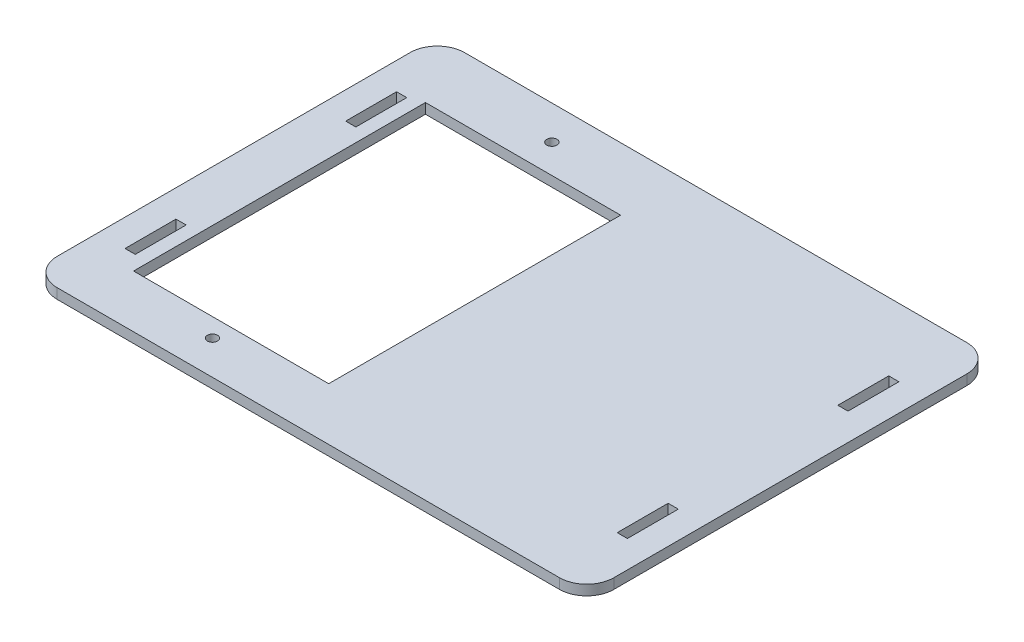
ISO-10303-21;
HEADER;
FILE_DESCRIPTION(('STEP AP214'),'2;1');
FILE_NAME('part.step','',(''),(''),'','','');
FILE_SCHEMA(('AUTOMOTIVE_DESIGN { 1 0 10303 214 1 1 1 1 }'));
ENDSEC;
DATA;
#1=APPLICATION_CONTEXT('core data for automotive mechanical design processes');
#2=APPLICATION_PROTOCOL_DEFINITION('international standard','automotive_design',2000,#1);
#3=PRODUCT_CONTEXT('',#1,'mechanical');
#4=PRODUCT('Part','Part','',(#3));
#5=PRODUCT_RELATED_PRODUCT_CATEGORY('part','',(#4));
#6=PRODUCT_DEFINITION_FORMATION('','',#4);
#7=PRODUCT_DEFINITION_CONTEXT('part definition',#1,'design');
#8=PRODUCT_DEFINITION('design','',#6,#7);
#9=PRODUCT_DEFINITION_SHAPE('','',#8);
#10=(LENGTH_UNIT() NAMED_UNIT(*) SI_UNIT(.MILLI.,.METRE.));
#11=(NAMED_UNIT(*) PLANE_ANGLE_UNIT() SI_UNIT($,.RADIAN.));
#12=(NAMED_UNIT(*) SI_UNIT($,.STERADIAN.) SOLID_ANGLE_UNIT());
#13=UNCERTAINTY_MEASURE_WITH_UNIT(LENGTH_MEASURE(1.E-05),#10,'distance_accuracy_value','');
#14=(GEOMETRIC_REPRESENTATION_CONTEXT(3) GLOBAL_UNCERTAINTY_ASSIGNED_CONTEXT((#13)) GLOBAL_UNIT_ASSIGNED_CONTEXT((#10,
#11,#12)) REPRESENTATION_CONTEXT('',''));
#15=CARTESIAN_POINT('',(0.,0.,0.));
#16=DIRECTION('',(0.,0.,1.));
#17=DIRECTION('',(1.,0.,0.));
#18=AXIS2_PLACEMENT_3D('',#15,#16,#17);
#19=CARTESIAN_POINT('',(74.,3.,-52.));
#20=DIRECTION('',(0.,-1.,0.));
#21=DIRECTION('',(0.,0.,-1.));
#22=AXIS2_PLACEMENT_3D('',#19,#20,#21);
#23=CYLINDRICAL_SURFACE('',#22,8.00000000000001);
#24=CARTESIAN_POINT('',(74.,0.,-52.));
#25=DIRECTION('',(0.,1.,0.));
#26=DIRECTION('',(0.,0.,-1.));
#27=AXIS2_PLACEMENT_3D('',#24,#25,#26);
#28=CIRCLE('',#27,8.00000000000001);
#29=CARTESIAN_POINT('',(82.,0.,-52.));
#30=VERTEX_POINT('',#29);
#31=CARTESIAN_POINT('',(74.,0.,-60.));
#32=VERTEX_POINT('',#31);
#33=EDGE_CURVE('E387',#30,#32,#28,.T.);
#34=ORIENTED_EDGE('',*,*,#33,.T.);
#35=DIRECTION('',(0.,-1.,0.));
#36=VECTOR('',#35,1.);
#37=CARTESIAN_POINT('',(74.,3.,-60.));
#38=LINE('',#37,#36);
#39=CARTESIAN_POINT('',(74.,3.,-60.));
#40=VERTEX_POINT('',#39);
#41=EDGE_CURVE('E11',#40,#32,#38,.T.);
#42=ORIENTED_EDGE('',*,*,#41,.F.);
#43=CARTESIAN_POINT('',(74.,3.,-52.));
#44=DIRECTION('',(0.,1.,0.));
#45=DIRECTION('',(0.,0.,-1.));
#46=AXIS2_PLACEMENT_3D('',#43,#44,#45);
#47=CIRCLE('',#46,8.00000000000001);
#48=CARTESIAN_POINT('',(82.,3.,-52.));
#49=VERTEX_POINT('',#48);
#50=EDGE_CURVE('E394',#49,#40,#47,.T.);
#51=ORIENTED_EDGE('',*,*,#50,.F.);
#52=DIRECTION('',(0.,-1.,0.));
#53=VECTOR('',#52,1.);
#54=CARTESIAN_POINT('',(82.,3.,-52.));
#55=LINE('',#54,#53);
#56=EDGE_CURVE('E412',#49,#30,#55,.T.);
#57=ORIENTED_EDGE('',*,*,#56,.T.);
#58=EDGE_LOOP('',(#34,#42,#51,#57));
#59=FACE_BOUND('',#58,.T.);
#60=ADVANCED_FACE('F33',(#59),#23,.T.);
#61=CARTESIAN_POINT('',(-74.,3.,-60.));
#62=DIRECTION('',(0.,0.,1.));
#63=DIRECTION('',(1.,0.,0.));
#64=AXIS2_PLACEMENT_3D('',#61,#62,#63);
#65=PLANE('',#64);
#66=DIRECTION('',(-1.,0.,0.));
#67=VECTOR('',#66,1.);
#68=CARTESIAN_POINT('',(-74.,0.,-60.));
#69=LINE('',#68,#67);
#70=CARTESIAN_POINT('',(-74.,0.,-60.));
#71=VERTEX_POINT('',#70);
#72=EDGE_CURVE('E415',#32,#71,#69,.T.);
#73=ORIENTED_EDGE('',*,*,#72,.T.);
#74=DIRECTION('',(0.,-1.,0.));
#75=VECTOR('',#74,1.);
#76=CARTESIAN_POINT('',(-74.,3.,-60.));
#77=LINE('',#76,#75);
#78=CARTESIAN_POINT('',(-74.,3.,-60.));
#79=VERTEX_POINT('',#78);
#80=EDGE_CURVE('E40',#79,#71,#77,.T.);
#81=ORIENTED_EDGE('',*,*,#80,.F.);
#82=DIRECTION('',(-1.,0.,0.));
#83=VECTOR('',#82,1.);
#84=CARTESIAN_POINT('',(-74.,3.,-60.));
#85=LINE('',#84,#83);
#86=EDGE_CURVE('E397',#40,#79,#85,.T.);
#87=ORIENTED_EDGE('',*,*,#86,.F.);
#88=ORIENTED_EDGE('',*,*,#41,.T.);
#89=EDGE_LOOP('',(#73,#81,#87,#88));
#90=FACE_BOUND('',#89,.T.);
#91=ADVANCED_FACE('F471',(#90),#65,.F.);
#92=CARTESIAN_POINT('',(-74.,3.,-52.));
#93=DIRECTION('',(0.,-1.,0.));
#94=DIRECTION('',(0.,0.,-1.));
#95=AXIS2_PLACEMENT_3D('',#92,#93,#94);
#96=CYLINDRICAL_SURFACE('',#95,8.00000000000001);
#97=CARTESIAN_POINT('',(-74.,0.,-52.));
#98=DIRECTION('',(0.,1.,0.));
#99=DIRECTION('',(0.,0.,-1.));
#100=AXIS2_PLACEMENT_3D('',#97,#98,#99);
#101=CIRCLE('',#100,8.00000000000001);
#102=CARTESIAN_POINT('',(-82.,0.,-52.));
#103=VERTEX_POINT('',#102);
#104=EDGE_CURVE('E417',#71,#103,#101,.T.);
#105=ORIENTED_EDGE('',*,*,#104,.T.);
#106=DIRECTION('',(0.,-1.,0.));
#107=VECTOR('',#106,1.);
#108=CARTESIAN_POINT('',(-82.,3.,-52.));
#109=LINE('',#108,#107);
#110=CARTESIAN_POINT('',(-82.,3.,-52.));
#111=VERTEX_POINT('',#110);
#112=EDGE_CURVE('E442',#111,#103,#109,.T.);
#113=ORIENTED_EDGE('',*,*,#112,.F.);
#114=CARTESIAN_POINT('',(-74.,3.,-52.));
#115=DIRECTION('',(0.,1.,0.));
#116=DIRECTION('',(0.,0.,-1.));
#117=AXIS2_PLACEMENT_3D('',#114,#115,#116);
#118=CIRCLE('',#117,8.00000000000001);
#119=EDGE_CURVE('E400',#79,#111,#118,.T.);
#120=ORIENTED_EDGE('',*,*,#119,.F.);
#121=ORIENTED_EDGE('',*,*,#80,.T.);
#122=EDGE_LOOP('',(#105,#113,#120,#121));
#123=FACE_BOUND('',#122,.T.);
#124=ADVANCED_FACE('F449',(#123),#96,.T.);
#125=CARTESIAN_POINT('',(-82.,3.,-52.));
#126=DIRECTION('',(1.,0.,0.));
#127=DIRECTION('',(0.,0.,-1.));
#128=AXIS2_PLACEMENT_3D('',#125,#126,#127);
#129=PLANE('',#128);
#130=DIRECTION('',(0.,0.,1.));
#131=VECTOR('',#130,1.);
#132=CARTESIAN_POINT('',(-82.,0.,-52.));
#133=LINE('',#132,#131);
#134=CARTESIAN_POINT('',(-82.,0.,52.));
#135=VERTEX_POINT('',#134);
#136=EDGE_CURVE('E419',#103,#135,#133,.T.);
#137=ORIENTED_EDGE('',*,*,#136,.T.);
#138=DIRECTION('',(0.,-1.,0.));
#139=VECTOR('',#138,1.);
#140=CARTESIAN_POINT('',(-82.,3.,52.));
#141=LINE('',#140,#139);
#142=CARTESIAN_POINT('',(-82.,3.,52.));
#143=VERTEX_POINT('',#142);
#144=EDGE_CURVE('E439',#143,#135,#141,.T.);
#145=ORIENTED_EDGE('',*,*,#144,.F.);
#146=DIRECTION('',(0.,0.,1.));
#147=VECTOR('',#146,1.);
#148=CARTESIAN_POINT('',(-82.,3.,-52.));
#149=LINE('',#148,#147);
#150=EDGE_CURVE('E402',#111,#143,#149,.T.);
#151=ORIENTED_EDGE('',*,*,#150,.F.);
#152=ORIENTED_EDGE('',*,*,#112,.T.);
#153=EDGE_LOOP('',(#137,#145,#151,#152));
#154=FACE_BOUND('',#153,.T.);
#155=ADVANCED_FACE('F459',(#154),#129,.F.);
#156=CARTESIAN_POINT('',(-74.,3.,52.));
#157=DIRECTION('',(0.,-1.,0.));
#158=DIRECTION('',(0.,0.,-1.));
#159=AXIS2_PLACEMENT_3D('',#156,#157,#158);
#160=CYLINDRICAL_SURFACE('',#159,8.);
#161=CARTESIAN_POINT('',(-74.,0.,52.));
#162=DIRECTION('',(0.,1.,0.));
#163=DIRECTION('',(0.,0.,-1.));
#164=AXIS2_PLACEMENT_3D('',#161,#162,#163);
#165=CIRCLE('',#164,8.);
#166=CARTESIAN_POINT('',(-74.,0.,60.));
#167=VERTEX_POINT('',#166);
#168=EDGE_CURVE('E421',#135,#167,#165,.T.);
#169=ORIENTED_EDGE('',*,*,#168,.T.);
#170=DIRECTION('',(0.,-1.,0.));
#171=VECTOR('',#170,1.);
#172=CARTESIAN_POINT('',(-74.,3.,60.));
#173=LINE('',#172,#171);
#174=CARTESIAN_POINT('',(-74.,3.,60.));
#175=VERTEX_POINT('',#174);
#176=EDGE_CURVE('E436',#175,#167,#173,.T.);
#177=ORIENTED_EDGE('',*,*,#176,.F.);
#178=CARTESIAN_POINT('',(-74.,3.,52.));
#179=DIRECTION('',(0.,1.,0.));
#180=DIRECTION('',(0.,0.,-1.));
#181=AXIS2_PLACEMENT_3D('',#178,#179,#180);
#182=CIRCLE('',#181,8.);
#183=EDGE_CURVE('E404',#143,#175,#182,.T.);
#184=ORIENTED_EDGE('',*,*,#183,.F.);
#185=ORIENTED_EDGE('',*,*,#144,.T.);
#186=EDGE_LOOP('',(#169,#177,#184,#185));
#187=FACE_BOUND('',#186,.T.);
#188=ADVANCED_FACE('F463',(#187),#160,.T.);
#189=CARTESIAN_POINT('',(-74.,3.,60.));
#190=DIRECTION('',(0.,0.,-1.));
#191=DIRECTION('',(-1.,0.,0.));
#192=AXIS2_PLACEMENT_3D('',#189,#190,#191);
#193=PLANE('',#192);
#194=DIRECTION('',(1.,0.,0.));
#195=VECTOR('',#194,1.);
#196=CARTESIAN_POINT('',(-74.,0.,60.));
#197=LINE('',#196,#195);
#198=CARTESIAN_POINT('',(74.,0.,60.));
#199=VERTEX_POINT('',#198);
#200=EDGE_CURVE('E423',#167,#199,#197,.T.);
#201=ORIENTED_EDGE('',*,*,#200,.T.);
#202=DIRECTION('',(0.,-1.,0.));
#203=VECTOR('',#202,1.);
#204=CARTESIAN_POINT('',(74.,3.,60.));
#205=LINE('',#204,#203);
#206=CARTESIAN_POINT('',(74.,3.,60.));
#207=VERTEX_POINT('',#206);
#208=EDGE_CURVE('E433',#207,#199,#205,.T.);
#209=ORIENTED_EDGE('',*,*,#208,.F.);
#210=DIRECTION('',(1.,0.,0.));
#211=VECTOR('',#210,1.);
#212=CARTESIAN_POINT('',(-74.,3.,60.));
#213=LINE('',#212,#211);
#214=EDGE_CURVE('E406',#175,#207,#213,.T.);
#215=ORIENTED_EDGE('',*,*,#214,.F.);
#216=ORIENTED_EDGE('',*,*,#176,.T.);
#217=EDGE_LOOP('',(#201,#209,#215,#216));
#218=FACE_BOUND('',#217,.T.);
#219=ADVANCED_FACE('F484',(#218),#193,.F.);
#220=CARTESIAN_POINT('',(74.,3.,52.));
#221=DIRECTION('',(0.,-1.,0.));
#222=DIRECTION('',(0.,0.,-1.));
#223=AXIS2_PLACEMENT_3D('',#220,#221,#222);
#224=CYLINDRICAL_SURFACE('',#223,8.);
#225=CARTESIAN_POINT('',(74.,0.,52.));
#226=DIRECTION('',(0.,1.,0.));
#227=DIRECTION('',(0.,0.,1.));
#228=AXIS2_PLACEMENT_3D('',#225,#226,#227);
#229=CIRCLE('',#228,8.);
#230=CARTESIAN_POINT('',(82.,0.,52.));
#231=VERTEX_POINT('',#230);
#232=EDGE_CURVE('E425',#199,#231,#229,.T.);
#233=ORIENTED_EDGE('',*,*,#232,.T.);
#234=DIRECTION('',(0.,-1.,0.));
#235=VECTOR('',#234,1.);
#236=CARTESIAN_POINT('',(82.,3.,52.));
#237=LINE('',#236,#235);
#238=CARTESIAN_POINT('',(82.,3.,52.));
#239=VERTEX_POINT('',#238);
#240=EDGE_CURVE('E430',#239,#231,#237,.T.);
#241=ORIENTED_EDGE('',*,*,#240,.F.);
#242=CARTESIAN_POINT('',(74.,3.,52.));
#243=DIRECTION('',(0.,1.,0.));
#244=DIRECTION('',(0.,0.,1.));
#245=AXIS2_PLACEMENT_3D('',#242,#243,#244);
#246=CIRCLE('',#245,8.);
#247=EDGE_CURVE('E408',#207,#239,#246,.T.);
#248=ORIENTED_EDGE('',*,*,#247,.F.);
#249=ORIENTED_EDGE('',*,*,#208,.T.);
#250=EDGE_LOOP('',(#233,#241,#248,#249));
#251=FACE_BOUND('',#250,.T.);
#252=ADVANCED_FACE('F482',(#251),#224,.T.);
#253=CARTESIAN_POINT('',(82.,3.,-52.));
#254=DIRECTION('',(-1.,0.,0.));
#255=DIRECTION('',(0.,0.,1.));
#256=AXIS2_PLACEMENT_3D('',#253,#254,#255);
#257=PLANE('',#256);
#258=DIRECTION('',(0.,0.,-1.));
#259=VECTOR('',#258,1.);
#260=CARTESIAN_POINT('',(82.,0.,-52.));
#261=LINE('',#260,#259);
#262=EDGE_CURVE('E398',#231,#30,#261,.T.);
#263=ORIENTED_EDGE('',*,*,#262,.T.);
#264=ORIENTED_EDGE('',*,*,#56,.F.);
#265=DIRECTION('',(0.,0.,-1.));
#266=VECTOR('',#265,1.);
#267=CARTESIAN_POINT('',(82.,3.,-52.));
#268=LINE('',#267,#266);
#269=EDGE_CURVE('E410',#239,#49,#268,.T.);
#270=ORIENTED_EDGE('',*,*,#269,.F.);
#271=ORIENTED_EDGE('',*,*,#240,.T.);
#272=EDGE_LOOP('',(#263,#264,#270,#271));
#273=FACE_BOUND('',#272,.T.);
#274=ADVANCED_FACE('F477',(#273),#257,.F.);
#275=CARTESIAN_POINT('',(74.,3.,-52.));
#276=DIRECTION('',(0.,-1.,0.));
#277=DIRECTION('',(0.,0.,-1.));
#278=AXIS2_PLACEMENT_3D('',#275,#276,#277);
#279=PLANE('',#278);
#280=DIRECTION('',(0.,0.,1.));
#281=VECTOR('',#280,1.);
#282=CARTESIAN_POINT('',(71.,3.,-40.));
#283=LINE('',#282,#281);
#284=CARTESIAN_POINT('',(71.,3.,-40.));
#285=VERTEX_POINT('',#284);
#286=CARTESIAN_POINT('',(71.,3.,-25.));
#287=VERTEX_POINT('',#286);
#288=EDGE_CURVE('E244',#285,#287,#283,.T.);
#289=ORIENTED_EDGE('',*,*,#288,.F.);
#290=DIRECTION('',(-1.,0.,0.));
#291=VECTOR('',#290,1.);
#292=CARTESIAN_POINT('',(74.,3.,-40.));
#293=LINE('',#292,#291);
#294=CARTESIAN_POINT('',(74.,3.,-40.));
#295=VERTEX_POINT('',#294);
#296=EDGE_CURVE('E47',#295,#285,#293,.T.);
#297=ORIENTED_EDGE('',*,*,#296,.F.);
#298=DIRECTION('',(0.,0.,-1.));
#299=VECTOR('',#298,1.);
#300=CARTESIAN_POINT('',(74.,3.,-40.));
#301=LINE('',#300,#299);
#302=CARTESIAN_POINT('',(74.,3.,-25.));
#303=VERTEX_POINT('',#302);
#304=EDGE_CURVE('E235',#303,#295,#301,.T.);
#305=ORIENTED_EDGE('',*,*,#304,.F.);
#306=DIRECTION('',(1.,0.,0.));
#307=VECTOR('',#306,1.);
#308=CARTESIAN_POINT('',(74.,3.,-25.));
#309=LINE('',#308,#307);
#310=EDGE_CURVE('E238',#287,#303,#309,.T.);
#311=ORIENTED_EDGE('',*,*,#310,.F.);
#312=EDGE_LOOP('',(#289,#297,#305,#311));
#313=FACE_BOUND('',#312,.T.);
#314=DIRECTION('',(0.,0.,1.));
#315=VECTOR('',#314,1.);
#316=CARTESIAN_POINT('',(71.,3.,25.));
#317=LINE('',#316,#315);
#318=CARTESIAN_POINT('',(71.,3.,25.));
#319=VERTEX_POINT('',#318);
#320=CARTESIAN_POINT('',(71.,3.,40.));
#321=VERTEX_POINT('',#320);
#322=EDGE_CURVE('E269',#319,#321,#317,.T.);
#323=ORIENTED_EDGE('',*,*,#322,.F.);
#324=DIRECTION('',(-1.,0.,0.));
#325=VECTOR('',#324,1.);
#326=CARTESIAN_POINT('',(74.,3.,25.));
#327=LINE('',#326,#325);
#328=CARTESIAN_POINT('',(74.,3.,25.));
#329=VERTEX_POINT('',#328);
#330=EDGE_CURVE('E250',#329,#319,#327,.T.);
#331=ORIENTED_EDGE('',*,*,#330,.F.);
#332=DIRECTION('',(0.,0.,-1.));
#333=VECTOR('',#332,1.);
#334=CARTESIAN_POINT('',(74.,3.,25.));
#335=LINE('',#334,#333);
#336=CARTESIAN_POINT('',(74.,3.,40.));
#337=VERTEX_POINT('',#336);
#338=EDGE_CURVE('E258',#337,#329,#335,.T.);
#339=ORIENTED_EDGE('',*,*,#338,.F.);
#340=DIRECTION('',(1.,0.,0.));
#341=VECTOR('',#340,1.);
#342=CARTESIAN_POINT('',(74.,3.,40.));
#343=LINE('',#342,#341);
#344=EDGE_CURVE('E272',#321,#337,#343,.T.);
#345=ORIENTED_EDGE('',*,*,#344,.F.);
#346=EDGE_LOOP('',(#323,#331,#339,#345));
#347=FACE_BOUND('',#346,.T.);
#348=DIRECTION('',(1.,0.,0.));
#349=VECTOR('',#348,1.);
#350=CARTESIAN_POINT('',(-74.,3.,40.));
#351=LINE('',#350,#349);
#352=CARTESIAN_POINT('',(-74.,3.,40.));
#353=VERTEX_POINT('',#352);
#354=CARTESIAN_POINT('',(-71.,3.,40.));
#355=VERTEX_POINT('',#354);
#356=EDGE_CURVE('E301',#353,#355,#351,.T.);
#357=ORIENTED_EDGE('',*,*,#356,.F.);
#358=DIRECTION('',(0.,0.,1.));
#359=VECTOR('',#358,1.);
#360=CARTESIAN_POINT('',(-74.,3.,25.));
#361=LINE('',#360,#359);
#362=CARTESIAN_POINT('',(-74.,3.,25.));
#363=VERTEX_POINT('',#362);
#364=EDGE_CURVE('E279',#363,#353,#361,.T.);
#365=ORIENTED_EDGE('',*,*,#364,.F.);
#366=DIRECTION('',(-1.,0.,0.));
#367=VECTOR('',#366,1.);
#368=CARTESIAN_POINT('',(-74.,3.,25.));
#369=LINE('',#368,#367);
#370=CARTESIAN_POINT('',(-71.,3.,25.));
#371=VERTEX_POINT('',#370);
#372=EDGE_CURVE('E290',#371,#363,#369,.T.);
#373=ORIENTED_EDGE('',*,*,#372,.F.);
#374=DIRECTION('',(0.,0.,-1.));
#375=VECTOR('',#374,1.);
#376=CARTESIAN_POINT('',(-71.,3.,25.));
#377=LINE('',#376,#375);
#378=EDGE_CURVE('E304',#355,#371,#377,.T.);
#379=ORIENTED_EDGE('',*,*,#378,.F.);
#380=EDGE_LOOP('',(#357,#365,#373,#379));
#381=FACE_BOUND('',#380,.T.);
#382=DIRECTION('',(1.,0.,0.));
#383=VECTOR('',#382,1.);
#384=CARTESIAN_POINT('',(-74.,3.,-25.));
#385=LINE('',#384,#383);
#386=CARTESIAN_POINT('',(-74.,3.,-25.));
#387=VERTEX_POINT('',#386);
#388=CARTESIAN_POINT('',(-71.,3.,-25.));
#389=VERTEX_POINT('',#388);
#390=EDGE_CURVE('E333',#387,#389,#385,.T.);
#391=ORIENTED_EDGE('',*,*,#390,.F.);
#392=DIRECTION('',(0.,0.,1.));
#393=VECTOR('',#392,1.);
#394=CARTESIAN_POINT('',(-74.,3.,-40.));
#395=LINE('',#394,#393);
#396=CARTESIAN_POINT('',(-74.,3.,-40.));
#397=VERTEX_POINT('',#396);
#398=EDGE_CURVE('E311',#397,#387,#395,.T.);
#399=ORIENTED_EDGE('',*,*,#398,.F.);
#400=DIRECTION('',(-1.,0.,0.));
#401=VECTOR('',#400,1.);
#402=CARTESIAN_POINT('',(-74.,3.,-40.));
#403=LINE('',#402,#401);
#404=CARTESIAN_POINT('',(-71.,3.,-40.));
#405=VERTEX_POINT('',#404);
#406=EDGE_CURVE('E322',#405,#397,#403,.T.);
#407=ORIENTED_EDGE('',*,*,#406,.F.);
#408=DIRECTION('',(0.,0.,-1.));
#409=VECTOR('',#408,1.);
#410=CARTESIAN_POINT('',(-71.,3.,-40.));
#411=LINE('',#410,#409);
#412=EDGE_CURVE('E336',#389,#405,#411,.T.);
#413=ORIENTED_EDGE('',*,*,#412,.F.);
#414=EDGE_LOOP('',(#391,#399,#407,#413));
#415=FACE_BOUND('',#414,.T.);
#416=CARTESIAN_POINT('',(-38.25,3.,50.));
#417=DIRECTION('',(0.,1.,0.));
#418=DIRECTION('',(0.,0.,1.));
#419=AXIS2_PLACEMENT_3D('',#416,#417,#418);
#420=CIRCLE('',#419,1.5);
#421=CARTESIAN_POINT('',(-38.25,3.,51.5));
#422=VERTEX_POINT('',#421);
#423=EDGE_CURVE('E343',#422,#422,#420,.T.);
#424=ORIENTED_EDGE('',*,*,#423,.F.);
#425=EDGE_LOOP('',(#424));
#426=FACE_BOUND('',#425,.T.);
#427=CARTESIAN_POINT('',(-38.25,3.,-50.));
#428=DIRECTION('',(0.,1.,0.));
#429=DIRECTION('',(0.,0.,1.));
#430=AXIS2_PLACEMENT_3D('',#427,#428,#429);
#431=CIRCLE('',#430,1.5);
#432=CARTESIAN_POINT('',(-38.25,3.,-48.5));
#433=VERTEX_POINT('',#432);
#434=EDGE_CURVE('E353',#433,#433,#431,.T.);
#435=ORIENTED_EDGE('',*,*,#434,.F.);
#436=EDGE_LOOP('',(#435));
#437=FACE_BOUND('',#436,.T.);
#438=DIRECTION('',(1.,0.,0.));
#439=VECTOR('',#438,1.);
#440=CARTESIAN_POINT('',(-67.,3.,44.5));
#441=LINE('',#440,#439);
#442=CARTESIAN_POINT('',(-67.,3.,44.5));
#443=VERTEX_POINT('',#442);
#444=CARTESIAN_POINT('',(-9.50000000000001,3.,44.5));
#445=VERTEX_POINT('',#444);
#446=EDGE_CURVE('E377',#443,#445,#441,.T.);
#447=ORIENTED_EDGE('',*,*,#446,.F.);
#448=DIRECTION('',(0.,0.,1.));
#449=VECTOR('',#448,1.);
#450=CARTESIAN_POINT('',(-67.,3.,-41.5));
#451=LINE('',#450,#449);
#452=CARTESIAN_POINT('',(-67.,3.,-41.5));
#453=VERTEX_POINT('',#452);
#454=EDGE_CURVE('E359',#453,#443,#451,.T.);
#455=ORIENTED_EDGE('',*,*,#454,.F.);
#456=DIRECTION('',(-1.,0.,0.));
#457=VECTOR('',#456,1.);
#458=CARTESIAN_POINT('',(-67.,3.,-41.5));
#459=LINE('',#458,#457);
#460=CARTESIAN_POINT('',(-9.5,3.,-41.5));
#461=VERTEX_POINT('',#460);
#462=EDGE_CURVE('E366',#461,#453,#459,.T.);
#463=ORIENTED_EDGE('',*,*,#462,.F.);
#464=DIRECTION('',(0.,0.,-1.));
#465=VECTOR('',#464,1.);
#466=CARTESIAN_POINT('',(-9.5,3.,-41.5));
#467=LINE('',#466,#465);
#468=EDGE_CURVE('E380',#445,#461,#467,.T.);
#469=ORIENTED_EDGE('',*,*,#468,.F.);
#470=EDGE_LOOP('',(#447,#455,#463,#469));
#471=FACE_BOUND('',#470,.T.);
#472=ORIENTED_EDGE('',*,*,#50,.T.);
#473=ORIENTED_EDGE('',*,*,#86,.T.);
#474=ORIENTED_EDGE('',*,*,#119,.T.);
#475=ORIENTED_EDGE('',*,*,#150,.T.);
#476=ORIENTED_EDGE('',*,*,#183,.T.);
#477=ORIENTED_EDGE('',*,*,#214,.T.);
#478=ORIENTED_EDGE('',*,*,#247,.T.);
#479=ORIENTED_EDGE('',*,*,#269,.T.);
#480=EDGE_LOOP('',(#472,#473,#474,#475,#476,#477,#478,#479));
#481=FACE_BOUND('',#480,.T.);
#482=ADVANCED_FACE('F467',(#313,#347,#381,#415,#426,#437,#471,#481),#279,.F.);
#483=CARTESIAN_POINT('',(74.,0.,-52.));
#484=DIRECTION('',(0.,-1.,0.));
#485=DIRECTION('',(0.,0.,-1.));
#486=AXIS2_PLACEMENT_3D('',#483,#484,#485);
#487=PLANE('',#486);
#488=DIRECTION('',(-1.,0.,0.));
#489=VECTOR('',#488,1.);
#490=CARTESIAN_POINT('',(74.,0.,-40.));
#491=LINE('',#490,#489);
#492=CARTESIAN_POINT('',(74.,0.,-40.));
#493=VERTEX_POINT('',#492);
#494=CARTESIAN_POINT('',(71.,0.,-40.));
#495=VERTEX_POINT('',#494);
#496=EDGE_CURVE('E219',#493,#495,#491,.T.);
#497=ORIENTED_EDGE('',*,*,#496,.T.);
#498=DIRECTION('',(0.,0.,1.));
#499=VECTOR('',#498,1.);
#500=CARTESIAN_POINT('',(71.,0.,-40.));
#501=LINE('',#500,#499);
#502=CARTESIAN_POINT('',(71.,0.,-25.));
#503=VERTEX_POINT('',#502);
#504=EDGE_CURVE('E228',#495,#503,#501,.T.);
#505=ORIENTED_EDGE('',*,*,#504,.T.);
#506=DIRECTION('',(1.,0.,0.));
#507=VECTOR('',#506,1.);
#508=CARTESIAN_POINT('',(74.,0.,-25.));
#509=LINE('',#508,#507);
#510=CARTESIAN_POINT('',(74.,0.,-25.));
#511=VERTEX_POINT('',#510);
#512=EDGE_CURVE('E55',#503,#511,#509,.T.);
#513=ORIENTED_EDGE('',*,*,#512,.T.);
#514=DIRECTION('',(0.,0.,-1.));
#515=VECTOR('',#514,1.);
#516=CARTESIAN_POINT('',(74.,0.,-40.));
#517=LINE('',#516,#515);
#518=EDGE_CURVE('E225',#511,#493,#517,.T.);
#519=ORIENTED_EDGE('',*,*,#518,.T.);
#520=EDGE_LOOP('',(#497,#505,#513,#519));
#521=FACE_BOUND('',#520,.T.);
#522=DIRECTION('',(-1.,0.,0.));
#523=VECTOR('',#522,1.);
#524=CARTESIAN_POINT('',(74.,0.,25.));
#525=LINE('',#524,#523);
#526=CARTESIAN_POINT('',(74.,0.,25.));
#527=VERTEX_POINT('',#526);
#528=CARTESIAN_POINT('',(71.,0.,25.));
#529=VERTEX_POINT('',#528);
#530=EDGE_CURVE('E254',#527,#529,#525,.T.);
#531=ORIENTED_EDGE('',*,*,#530,.T.);
#532=DIRECTION('',(0.,0.,1.));
#533=VECTOR('',#532,1.);
#534=CARTESIAN_POINT('',(71.,0.,25.));
#535=LINE('',#534,#533);
#536=CARTESIAN_POINT('',(71.,0.,40.));
#537=VERTEX_POINT('',#536);
#538=EDGE_CURVE('E257',#529,#537,#535,.T.);
#539=ORIENTED_EDGE('',*,*,#538,.T.);
#540=DIRECTION('',(1.,0.,0.));
#541=VECTOR('',#540,1.);
#542=CARTESIAN_POINT('',(74.,0.,40.));
#543=LINE('',#542,#541);
#544=CARTESIAN_POINT('',(74.,0.,40.));
#545=VERTEX_POINT('',#544);
#546=EDGE_CURVE('E261',#537,#545,#543,.T.);
#547=ORIENTED_EDGE('',*,*,#546,.T.);
#548=DIRECTION('',(0.,0.,-1.));
#549=VECTOR('',#548,1.);
#550=CARTESIAN_POINT('',(74.,0.,25.));
#551=LINE('',#550,#549);
#552=EDGE_CURVE('E264',#545,#527,#551,.T.);
#553=ORIENTED_EDGE('',*,*,#552,.T.);
#554=EDGE_LOOP('',(#531,#539,#547,#553));
#555=FACE_BOUND('',#554,.T.);
#556=DIRECTION('',(0.,0.,1.));
#557=VECTOR('',#556,1.);
#558=CARTESIAN_POINT('',(-74.,0.,25.));
#559=LINE('',#558,#557);
#560=CARTESIAN_POINT('',(-74.,0.,25.));
#561=VERTEX_POINT('',#560);
#562=CARTESIAN_POINT('',(-74.,0.,40.));
#563=VERTEX_POINT('',#562);
#564=EDGE_CURVE('E286',#561,#563,#559,.T.);
#565=ORIENTED_EDGE('',*,*,#564,.T.);
#566=DIRECTION('',(1.,0.,0.));
#567=VECTOR('',#566,1.);
#568=CARTESIAN_POINT('',(-74.,0.,40.));
#569=LINE('',#568,#567);
#570=CARTESIAN_POINT('',(-71.,0.,40.));
#571=VERTEX_POINT('',#570);
#572=EDGE_CURVE('E289',#563,#571,#569,.T.);
#573=ORIENTED_EDGE('',*,*,#572,.T.);
#574=DIRECTION('',(0.,0.,-1.));
#575=VECTOR('',#574,1.);
#576=CARTESIAN_POINT('',(-71.,0.,25.));
#577=LINE('',#576,#575);
#578=CARTESIAN_POINT('',(-71.,0.,25.));
#579=VERTEX_POINT('',#578);
#580=EDGE_CURVE('E293',#571,#579,#577,.T.);
#581=ORIENTED_EDGE('',*,*,#580,.T.);
#582=DIRECTION('',(-1.,0.,0.));
#583=VECTOR('',#582,1.);
#584=CARTESIAN_POINT('',(-74.,0.,25.));
#585=LINE('',#584,#583);
#586=EDGE_CURVE('E296',#579,#561,#585,.T.);
#587=ORIENTED_EDGE('',*,*,#586,.T.);
#588=EDGE_LOOP('',(#565,#573,#581,#587));
#589=FACE_BOUND('',#588,.T.);
#590=DIRECTION('',(0.,0.,1.));
#591=VECTOR('',#590,1.);
#592=CARTESIAN_POINT('',(-74.,0.,-40.));
#593=LINE('',#592,#591);
#594=CARTESIAN_POINT('',(-74.,0.,-40.));
#595=VERTEX_POINT('',#594);
#596=CARTESIAN_POINT('',(-74.,0.,-25.));
#597=VERTEX_POINT('',#596);
#598=EDGE_CURVE('E318',#595,#597,#593,.T.);
#599=ORIENTED_EDGE('',*,*,#598,.T.);
#600=DIRECTION('',(1.,0.,0.));
#601=VECTOR('',#600,1.);
#602=CARTESIAN_POINT('',(-74.,0.,-25.));
#603=LINE('',#602,#601);
#604=CARTESIAN_POINT('',(-71.,0.,-25.));
#605=VERTEX_POINT('',#604);
#606=EDGE_CURVE('E321',#597,#605,#603,.T.);
#607=ORIENTED_EDGE('',*,*,#606,.T.);
#608=DIRECTION('',(0.,0.,-1.));
#609=VECTOR('',#608,1.);
#610=CARTESIAN_POINT('',(-71.,0.,-40.));
#611=LINE('',#610,#609);
#612=CARTESIAN_POINT('',(-71.,0.,-40.));
#613=VERTEX_POINT('',#612);
#614=EDGE_CURVE('E325',#605,#613,#611,.T.);
#615=ORIENTED_EDGE('',*,*,#614,.T.);
#616=DIRECTION('',(-1.,0.,0.));
#617=VECTOR('',#616,1.);
#618=CARTESIAN_POINT('',(-74.,0.,-40.));
#619=LINE('',#618,#617);
#620=EDGE_CURVE('E328',#613,#595,#619,.T.);
#621=ORIENTED_EDGE('',*,*,#620,.T.);
#622=EDGE_LOOP('',(#599,#607,#615,#621));
#623=FACE_BOUND('',#622,.T.);
#624=CARTESIAN_POINT('',(-38.25,0.,50.));
#625=DIRECTION('',(0.,1.,0.));
#626=DIRECTION('',(0.,0.,1.));
#627=AXIS2_PLACEMENT_3D('',#624,#625,#626);
#628=CIRCLE('',#627,1.5);
#629=CARTESIAN_POINT('',(-38.25,0.,51.5));
#630=VERTEX_POINT('',#629);
#631=EDGE_CURVE('E350',#630,#630,#628,.T.);
#632=ORIENTED_EDGE('',*,*,#631,.T.);
#633=EDGE_LOOP('',(#632));
#634=FACE_BOUND('',#633,.T.);
#635=CARTESIAN_POINT('',(-38.25,0.,-50.));
#636=DIRECTION('',(0.,1.,0.));
#637=DIRECTION('',(0.,0.,1.));
#638=AXIS2_PLACEMENT_3D('',#635,#636,#637);
#639=CIRCLE('',#638,1.5);
#640=CARTESIAN_POINT('',(-38.25,0.,-48.5));
#641=VERTEX_POINT('',#640);
#642=EDGE_CURVE('E356',#641,#641,#639,.T.);
#643=ORIENTED_EDGE('',*,*,#642,.T.);
#644=EDGE_LOOP('',(#643));
#645=FACE_BOUND('',#644,.T.);
#646=DIRECTION('',(0.,0.,1.));
#647=VECTOR('',#646,1.);
#648=CARTESIAN_POINT('',(-67.,0.,-41.5));
#649=LINE('',#648,#647);
#650=CARTESIAN_POINT('',(-67.,0.,-41.5));
#651=VERTEX_POINT('',#650);
#652=CARTESIAN_POINT('',(-67.,0.,44.5));
#653=VERTEX_POINT('',#652);
#654=EDGE_CURVE('E362',#651,#653,#649,.T.);
#655=ORIENTED_EDGE('',*,*,#654,.T.);
#656=DIRECTION('',(1.,0.,0.));
#657=VECTOR('',#656,1.);
#658=CARTESIAN_POINT('',(-67.,0.,44.5));
#659=LINE('',#658,#657);
#660=CARTESIAN_POINT('',(-9.50000000000001,0.,44.5));
#661=VERTEX_POINT('',#660);
#662=EDGE_CURVE('E365',#653,#661,#659,.T.);
#663=ORIENTED_EDGE('',*,*,#662,.T.);
#664=DIRECTION('',(0.,0.,-1.));
#665=VECTOR('',#664,1.);
#666=CARTESIAN_POINT('',(-9.5,0.,-41.5));
#667=LINE('',#666,#665);
#668=CARTESIAN_POINT('',(-9.5,0.,-41.5));
#669=VERTEX_POINT('',#668);
#670=EDGE_CURVE('E369',#661,#669,#667,.T.);
#671=ORIENTED_EDGE('',*,*,#670,.T.);
#672=DIRECTION('',(-1.,0.,0.));
#673=VECTOR('',#672,1.);
#674=CARTESIAN_POINT('',(-67.,0.,-41.5));
#675=LINE('',#674,#673);
#676=EDGE_CURVE('E372',#669,#651,#675,.T.);
#677=ORIENTED_EDGE('',*,*,#676,.T.);
#678=EDGE_LOOP('',(#655,#663,#671,#677));
#679=FACE_BOUND('',#678,.T.);
#680=ORIENTED_EDGE('',*,*,#33,.F.);
#681=ORIENTED_EDGE('',*,*,#262,.F.);
#682=ORIENTED_EDGE('',*,*,#232,.F.);
#683=ORIENTED_EDGE('',*,*,#200,.F.);
#684=ORIENTED_EDGE('',*,*,#168,.F.);
#685=ORIENTED_EDGE('',*,*,#136,.F.);
#686=ORIENTED_EDGE('',*,*,#104,.F.);
#687=ORIENTED_EDGE('',*,*,#72,.F.);
#688=EDGE_LOOP('',(#680,#681,#682,#683,#684,#685,#686,#687));
#689=FACE_BOUND('',#688,.T.);
#690=ADVANCED_FACE('F232',(#521,#555,#589,#623,#634,#645,#679,#689),#487,.T.);
#691=CARTESIAN_POINT('',(-67.,0.,-41.5));
#692=DIRECTION('',(-1.,0.,0.));
#693=DIRECTION('',(0.,0.,1.));
#694=AXIS2_PLACEMENT_3D('',#691,#692,#693);
#695=PLANE('',#694);
#696=ORIENTED_EDGE('',*,*,#454,.T.);
#697=DIRECTION('',(0.,1.,0.));
#698=VECTOR('',#697,1.);
#699=CARTESIAN_POINT('',(-67.,0.,44.5));
#700=LINE('',#699,#698);
#701=EDGE_CURVE('E375',#653,#443,#700,.T.);
#702=ORIENTED_EDGE('',*,*,#701,.F.);
#703=ORIENTED_EDGE('',*,*,#654,.F.);
#704=DIRECTION('',(0.,1.,0.));
#705=VECTOR('',#704,1.);
#706=CARTESIAN_POINT('',(-67.,0.,-41.5));
#707=LINE('',#706,#705);
#708=EDGE_CURVE('E385',#651,#453,#707,.T.);
#709=ORIENTED_EDGE('',*,*,#708,.T.);
#710=EDGE_LOOP('',(#696,#702,#703,#709));
#711=FACE_BOUND('',#710,.T.);
#712=ADVANCED_FACE('F536',(#711),#695,.F.);
#713=CARTESIAN_POINT('',(-67.,0.,-41.5));
#714=DIRECTION('',(0.,0.,-1.));
#715=DIRECTION('',(-1.,0.,0.));
#716=AXIS2_PLACEMENT_3D('',#713,#714,#715);
#717=PLANE('',#716);
#718=ORIENTED_EDGE('',*,*,#462,.T.);
#719=ORIENTED_EDGE('',*,*,#708,.F.);
#720=ORIENTED_EDGE('',*,*,#676,.F.);
#721=DIRECTION('',(0.,1.,0.));
#722=VECTOR('',#721,1.);
#723=CARTESIAN_POINT('',(-9.5,0.,-41.5));
#724=LINE('',#723,#722);
#725=EDGE_CURVE('E388',#669,#461,#724,.T.);
#726=ORIENTED_EDGE('',*,*,#725,.T.);
#727=EDGE_LOOP('',(#718,#719,#720,#726));
#728=FACE_BOUND('',#727,.T.);
#729=ADVANCED_FACE('F541',(#728),#717,.F.);
#730=CARTESIAN_POINT('',(-9.5,0.,-41.5));
#731=DIRECTION('',(1.,0.,0.));
#732=DIRECTION('',(0.,0.,-1.));
#733=AXIS2_PLACEMENT_3D('',#730,#731,#732);
#734=PLANE('',#733);
#735=ORIENTED_EDGE('',*,*,#468,.T.);
#736=ORIENTED_EDGE('',*,*,#725,.F.);
#737=ORIENTED_EDGE('',*,*,#670,.F.);
#738=DIRECTION('',(0.,1.,0.));
#739=VECTOR('',#738,1.);
#740=CARTESIAN_POINT('',(-9.50000000000001,0.,44.5));
#741=LINE('',#740,#739);
#742=EDGE_CURVE('E390',#661,#445,#741,.T.);
#743=ORIENTED_EDGE('',*,*,#742,.T.);
#744=EDGE_LOOP('',(#735,#736,#737,#743));
#745=FACE_BOUND('',#744,.T.);
#746=ADVANCED_FACE('F553',(#745),#734,.F.);
#747=CARTESIAN_POINT('',(-67.,0.,44.5));
#748=DIRECTION('',(0.,0.,1.));
#749=DIRECTION('',(1.,0.,0.));
#750=AXIS2_PLACEMENT_3D('',#747,#748,#749);
#751=PLANE('',#750);
#752=ORIENTED_EDGE('',*,*,#446,.T.);
#753=ORIENTED_EDGE('',*,*,#742,.F.);
#754=ORIENTED_EDGE('',*,*,#662,.F.);
#755=ORIENTED_EDGE('',*,*,#701,.T.);
#756=EDGE_LOOP('',(#752,#753,#754,#755));
#757=FACE_BOUND('',#756,.T.);
#758=ADVANCED_FACE('F563',(#757),#751,.F.);
#759=CARTESIAN_POINT('',(-38.25,0.,-50.));
#760=DIRECTION('',(0.,1.,0.));
#761=DIRECTION('',(0.,0.,1.));
#762=AXIS2_PLACEMENT_3D('',#759,#760,#761);
#763=CYLINDRICAL_SURFACE('',#762,1.5);
#764=ORIENTED_EDGE('',*,*,#642,.F.);
#765=EDGE_LOOP('',(#764));
#766=FACE_BOUND('',#765,.T.);
#767=ORIENTED_EDGE('',*,*,#434,.T.);
#768=EDGE_LOOP('',(#767));
#769=FACE_BOUND('',#768,.T.);
#770=ADVANCED_FACE('F573',(#766,#769),#763,.F.);
#771=CARTESIAN_POINT('',(-38.25,0.,50.));
#772=DIRECTION('',(0.,1.,0.));
#773=DIRECTION('',(0.,0.,1.));
#774=AXIS2_PLACEMENT_3D('',#771,#772,#773);
#775=CYLINDRICAL_SURFACE('',#774,1.5);
#776=ORIENTED_EDGE('',*,*,#631,.F.);
#777=EDGE_LOOP('',(#776));
#778=FACE_BOUND('',#777,.T.);
#779=ORIENTED_EDGE('',*,*,#423,.T.);
#780=EDGE_LOOP('',(#779));
#781=FACE_BOUND('',#780,.T.);
#782=ADVANCED_FACE('F583',(#778,#781),#775,.F.);
#783=CARTESIAN_POINT('',(-74.,0.,-40.));
#784=DIRECTION('',(-1.,0.,0.));
#785=DIRECTION('',(0.,0.,1.));
#786=AXIS2_PLACEMENT_3D('',#783,#784,#785);
#787=PLANE('',#786);
#788=ORIENTED_EDGE('',*,*,#398,.T.);
#789=DIRECTION('',(0.,1.,0.));
#790=VECTOR('',#789,1.);
#791=CARTESIAN_POINT('',(-74.,0.,-25.));
#792=LINE('',#791,#790);
#793=EDGE_CURVE('E331',#597,#387,#792,.T.);
#794=ORIENTED_EDGE('',*,*,#793,.F.);
#795=ORIENTED_EDGE('',*,*,#598,.F.);
#796=DIRECTION('',(0.,1.,0.));
#797=VECTOR('',#796,1.);
#798=CARTESIAN_POINT('',(-74.,0.,-40.));
#799=LINE('',#798,#797);
#800=EDGE_CURVE('E341',#595,#397,#799,.T.);
#801=ORIENTED_EDGE('',*,*,#800,.T.);
#802=EDGE_LOOP('',(#788,#794,#795,#801));
#803=FACE_BOUND('',#802,.T.);
#804=ADVANCED_FACE('F593',(#803),#787,.F.);
#805=CARTESIAN_POINT('',(-74.,0.,-40.));
#806=DIRECTION('',(0.,0.,-1.));
#807=DIRECTION('',(-1.,0.,0.));
#808=AXIS2_PLACEMENT_3D('',#805,#806,#807);
#809=PLANE('',#808);
#810=ORIENTED_EDGE('',*,*,#406,.T.);
#811=ORIENTED_EDGE('',*,*,#800,.F.);
#812=ORIENTED_EDGE('',*,*,#620,.F.);
#813=DIRECTION('',(0.,1.,0.));
#814=VECTOR('',#813,1.);
#815=CARTESIAN_POINT('',(-71.,0.,-40.));
#816=LINE('',#815,#814);
#817=EDGE_CURVE('E344',#613,#405,#816,.T.);
#818=ORIENTED_EDGE('',*,*,#817,.T.);
#819=EDGE_LOOP('',(#810,#811,#812,#818));
#820=FACE_BOUND('',#819,.T.);
#821=ADVANCED_FACE('F616',(#820),#809,.F.);
#822=CARTESIAN_POINT('',(-71.,0.,-40.));
#823=DIRECTION('',(1.,0.,0.));
#824=DIRECTION('',(0.,0.,-1.));
#825=AXIS2_PLACEMENT_3D('',#822,#823,#824);
#826=PLANE('',#825);
#827=ORIENTED_EDGE('',*,*,#412,.T.);
#828=ORIENTED_EDGE('',*,*,#817,.F.);
#829=ORIENTED_EDGE('',*,*,#614,.F.);
#830=DIRECTION('',(0.,1.,0.));
#831=VECTOR('',#830,1.);
#832=CARTESIAN_POINT('',(-71.,0.,-25.));
#833=LINE('',#832,#831);
#834=EDGE_CURVE('E346',#605,#389,#833,.T.);
#835=ORIENTED_EDGE('',*,*,#834,.T.);
#836=EDGE_LOOP('',(#827,#828,#829,#835));
#837=FACE_BOUND('',#836,.T.);
#838=ADVANCED_FACE('F626',(#837),#826,.F.);
#839=CARTESIAN_POINT('',(-74.,0.,-25.));
#840=DIRECTION('',(0.,0.,1.));
#841=DIRECTION('',(1.,0.,0.));
#842=AXIS2_PLACEMENT_3D('',#839,#840,#841);
#843=PLANE('',#842);
#844=ORIENTED_EDGE('',*,*,#390,.T.);
#845=ORIENTED_EDGE('',*,*,#834,.F.);
#846=ORIENTED_EDGE('',*,*,#606,.F.);
#847=ORIENTED_EDGE('',*,*,#793,.T.);
#848=EDGE_LOOP('',(#844,#845,#846,#847));
#849=FACE_BOUND('',#848,.T.);
#850=ADVANCED_FACE('F636',(#849),#843,.F.);
#851=CARTESIAN_POINT('',(-74.,0.,25.));
#852=DIRECTION('',(-1.,0.,0.));
#853=DIRECTION('',(0.,0.,1.));
#854=AXIS2_PLACEMENT_3D('',#851,#852,#853);
#855=PLANE('',#854);
#856=ORIENTED_EDGE('',*,*,#364,.T.);
#857=DIRECTION('',(0.,1.,0.));
#858=VECTOR('',#857,1.);
#859=CARTESIAN_POINT('',(-74.,0.,40.));
#860=LINE('',#859,#858);
#861=EDGE_CURVE('E299',#563,#353,#860,.T.);
#862=ORIENTED_EDGE('',*,*,#861,.F.);
#863=ORIENTED_EDGE('',*,*,#564,.F.);
#864=DIRECTION('',(0.,1.,0.));
#865=VECTOR('',#864,1.);
#866=CARTESIAN_POINT('',(-74.,0.,25.));
#867=LINE('',#866,#865);
#868=EDGE_CURVE('E309',#561,#363,#867,.T.);
#869=ORIENTED_EDGE('',*,*,#868,.T.);
#870=EDGE_LOOP('',(#856,#862,#863,#869));
#871=FACE_BOUND('',#870,.T.);
#872=ADVANCED_FACE('F646',(#871),#855,.F.);
#873=CARTESIAN_POINT('',(-74.,0.,25.));
#874=DIRECTION('',(0.,0.,-1.));
#875=DIRECTION('',(-1.,0.,0.));
#876=AXIS2_PLACEMENT_3D('',#873,#874,#875);
#877=PLANE('',#876);
#878=ORIENTED_EDGE('',*,*,#372,.T.);
#879=ORIENTED_EDGE('',*,*,#868,.F.);
#880=ORIENTED_EDGE('',*,*,#586,.F.);
#881=DIRECTION('',(0.,1.,0.));
#882=VECTOR('',#881,1.);
#883=CARTESIAN_POINT('',(-71.,0.,25.));
#884=LINE('',#883,#882);
#885=EDGE_CURVE('E312',#579,#371,#884,.T.);
#886=ORIENTED_EDGE('',*,*,#885,.T.);
#887=EDGE_LOOP('',(#878,#879,#880,#886));
#888=FACE_BOUND('',#887,.T.);
#889=ADVANCED_FACE('F656',(#888),#877,.F.);
#890=CARTESIAN_POINT('',(-71.,0.,25.));
#891=DIRECTION('',(1.,0.,0.));
#892=DIRECTION('',(0.,0.,-1.));
#893=AXIS2_PLACEMENT_3D('',#890,#891,#892);
#894=PLANE('',#893);
#895=ORIENTED_EDGE('',*,*,#378,.T.);
#896=ORIENTED_EDGE('',*,*,#885,.F.);
#897=ORIENTED_EDGE('',*,*,#580,.F.);
#898=DIRECTION('',(0.,1.,0.));
#899=VECTOR('',#898,1.);
#900=CARTESIAN_POINT('',(-71.,0.,40.));
#901=LINE('',#900,#899);
#902=EDGE_CURVE('E314',#571,#355,#901,.T.);
#903=ORIENTED_EDGE('',*,*,#902,.T.);
#904=EDGE_LOOP('',(#895,#896,#897,#903));
#905=FACE_BOUND('',#904,.T.);
#906=ADVANCED_FACE('F666',(#905),#894,.F.);
#907=CARTESIAN_POINT('',(-74.,0.,40.));
#908=DIRECTION('',(0.,0.,1.));
#909=DIRECTION('',(1.,0.,0.));
#910=AXIS2_PLACEMENT_3D('',#907,#908,#909);
#911=PLANE('',#910);
#912=ORIENTED_EDGE('',*,*,#356,.T.);
#913=ORIENTED_EDGE('',*,*,#902,.F.);
#914=ORIENTED_EDGE('',*,*,#572,.F.);
#915=ORIENTED_EDGE('',*,*,#861,.T.);
#916=EDGE_LOOP('',(#912,#913,#914,#915));
#917=FACE_BOUND('',#916,.T.);
#918=ADVANCED_FACE('F676',(#917),#911,.F.);
#919=CARTESIAN_POINT('',(74.,0.,25.));
#920=DIRECTION('',(0.,0.,-1.));
#921=DIRECTION('',(-1.,0.,0.));
#922=AXIS2_PLACEMENT_3D('',#919,#920,#921);
#923=PLANE('',#922);
#924=ORIENTED_EDGE('',*,*,#330,.T.);
#925=DIRECTION('',(0.,1.,0.));
#926=VECTOR('',#925,1.);
#927=CARTESIAN_POINT('',(71.,0.,25.));
#928=LINE('',#927,#926);
#929=EDGE_CURVE('E267',#529,#319,#928,.T.);
#930=ORIENTED_EDGE('',*,*,#929,.F.);
#931=ORIENTED_EDGE('',*,*,#530,.F.);
#932=DIRECTION('',(0.,1.,0.));
#933=VECTOR('',#932,1.);
#934=CARTESIAN_POINT('',(74.,0.,25.));
#935=LINE('',#934,#933);
#936=EDGE_CURVE('E277',#527,#329,#935,.T.);
#937=ORIENTED_EDGE('',*,*,#936,.T.);
#938=EDGE_LOOP('',(#924,#930,#931,#937));
#939=FACE_BOUND('',#938,.T.);
#940=ADVANCED_FACE('F686',(#939),#923,.F.);
#941=CARTESIAN_POINT('',(74.,0.,25.));
#942=DIRECTION('',(1.,0.,0.));
#943=DIRECTION('',(0.,0.,-1.));
#944=AXIS2_PLACEMENT_3D('',#941,#942,#943);
#945=PLANE('',#944);
#946=ORIENTED_EDGE('',*,*,#338,.T.);
#947=ORIENTED_EDGE('',*,*,#936,.F.);
#948=ORIENTED_EDGE('',*,*,#552,.F.);
#949=DIRECTION('',(0.,1.,0.));
#950=VECTOR('',#949,1.);
#951=CARTESIAN_POINT('',(74.,0.,40.));
#952=LINE('',#951,#950);
#953=EDGE_CURVE('E280',#545,#337,#952,.T.);
#954=ORIENTED_EDGE('',*,*,#953,.T.);
#955=EDGE_LOOP('',(#946,#947,#948,#954));
#956=FACE_BOUND('',#955,.T.);
#957=ADVANCED_FACE('F696',(#956),#945,.F.);
#958=CARTESIAN_POINT('',(74.,0.,40.));
#959=DIRECTION('',(0.,0.,1.));
#960=DIRECTION('',(1.,0.,0.));
#961=AXIS2_PLACEMENT_3D('',#958,#959,#960);
#962=PLANE('',#961);
#963=ORIENTED_EDGE('',*,*,#344,.T.);
#964=ORIENTED_EDGE('',*,*,#953,.F.);
#965=ORIENTED_EDGE('',*,*,#546,.F.);
#966=DIRECTION('',(0.,1.,0.));
#967=VECTOR('',#966,1.);
#968=CARTESIAN_POINT('',(71.,0.,40.));
#969=LINE('',#968,#967);
#970=EDGE_CURVE('E282',#537,#321,#969,.T.);
#971=ORIENTED_EDGE('',*,*,#970,.T.);
#972=EDGE_LOOP('',(#963,#964,#965,#971));
#973=FACE_BOUND('',#972,.T.);
#974=ADVANCED_FACE('F706',(#973),#962,.F.);
#975=CARTESIAN_POINT('',(71.,0.,25.));
#976=DIRECTION('',(-1.,0.,0.));
#977=DIRECTION('',(0.,0.,1.));
#978=AXIS2_PLACEMENT_3D('',#975,#976,#977);
#979=PLANE('',#978);
#980=ORIENTED_EDGE('',*,*,#322,.T.);
#981=ORIENTED_EDGE('',*,*,#970,.F.);
#982=ORIENTED_EDGE('',*,*,#538,.F.);
#983=ORIENTED_EDGE('',*,*,#929,.T.);
#984=EDGE_LOOP('',(#980,#981,#982,#983));
#985=FACE_BOUND('',#984,.T.);
#986=ADVANCED_FACE('F716',(#985),#979,.F.);
#987=CARTESIAN_POINT('',(74.,0.,-40.));
#988=DIRECTION('',(0.,0.,-1.));
#989=DIRECTION('',(-1.,0.,0.));
#990=AXIS2_PLACEMENT_3D('',#987,#988,#989);
#991=PLANE('',#990);
#992=ORIENTED_EDGE('',*,*,#296,.T.);
#993=DIRECTION('',(0.,1.,0.));
#994=VECTOR('',#993,1.);
#995=CARTESIAN_POINT('',(71.,0.,-40.));
#996=LINE('',#995,#994);
#997=EDGE_CURVE('E215',#495,#285,#996,.T.);
#998=ORIENTED_EDGE('',*,*,#997,.F.);
#999=ORIENTED_EDGE('',*,*,#496,.F.);
#1000=DIRECTION('',(0.,1.,0.));
#1001=VECTOR('',#1000,1.);
#1002=CARTESIAN_POINT('',(74.,0.,-40.));
#1003=LINE('',#1002,#1001);
#1004=EDGE_CURVE('E248',#493,#295,#1003,.T.);
#1005=ORIENTED_EDGE('',*,*,#1004,.T.);
#1006=EDGE_LOOP('',(#992,#998,#999,#1005));
#1007=FACE_BOUND('',#1006,.T.);
#1008=ADVANCED_FACE('F217',(#1007),#991,.F.);
#1009=CARTESIAN_POINT('',(74.,0.,-40.));
#1010=DIRECTION('',(1.,0.,0.));
#1011=DIRECTION('',(0.,0.,-1.));
#1012=AXIS2_PLACEMENT_3D('',#1009,#1010,#1011);
#1013=PLANE('',#1012);
#1014=ORIENTED_EDGE('',*,*,#304,.T.);
#1015=ORIENTED_EDGE('',*,*,#1004,.F.);
#1016=ORIENTED_EDGE('',*,*,#518,.F.);
#1017=DIRECTION('',(0.,1.,0.));
#1018=VECTOR('',#1017,1.);
#1019=CARTESIAN_POINT('',(74.,0.,-25.));
#1020=LINE('',#1019,#1018);
#1021=EDGE_CURVE('E251',#511,#303,#1020,.T.);
#1022=ORIENTED_EDGE('',*,*,#1021,.T.);
#1023=EDGE_LOOP('',(#1014,#1015,#1016,#1022));
#1024=FACE_BOUND('',#1023,.T.);
#1025=ADVANCED_FACE('F735',(#1024),#1013,.F.);
#1026=CARTESIAN_POINT('',(74.,0.,-25.));
#1027=DIRECTION('',(0.,0.,1.));
#1028=DIRECTION('',(1.,0.,0.));
#1029=AXIS2_PLACEMENT_3D('',#1026,#1027,#1028);
#1030=PLANE('',#1029);
#1031=ORIENTED_EDGE('',*,*,#310,.T.);
#1032=ORIENTED_EDGE('',*,*,#1021,.F.);
#1033=ORIENTED_EDGE('',*,*,#512,.F.);
#1034=DIRECTION('',(0.,1.,0.));
#1035=VECTOR('',#1034,1.);
#1036=CARTESIAN_POINT('',(71.,0.,-25.));
#1037=LINE('',#1036,#1035);
#1038=EDGE_CURVE('E224',#503,#287,#1037,.T.);
#1039=ORIENTED_EDGE('',*,*,#1038,.T.);
#1040=EDGE_LOOP('',(#1031,#1032,#1033,#1039));
#1041=FACE_BOUND('',#1040,.T.);
#1042=ADVANCED_FACE('F744',(#1041),#1030,.F.);
#1043=CARTESIAN_POINT('',(71.,0.,-40.));
#1044=DIRECTION('',(-1.,0.,0.));
#1045=DIRECTION('',(0.,0.,1.));
#1046=AXIS2_PLACEMENT_3D('',#1043,#1044,#1045);
#1047=PLANE('',#1046);
#1048=ORIENTED_EDGE('',*,*,#288,.T.);
#1049=ORIENTED_EDGE('',*,*,#1038,.F.);
#1050=ORIENTED_EDGE('',*,*,#504,.F.);
#1051=ORIENTED_EDGE('',*,*,#997,.T.);
#1052=EDGE_LOOP('',(#1048,#1049,#1050,#1051));
#1053=FACE_BOUND('',#1052,.T.);
#1054=ADVANCED_FACE('F229',(#1053),#1047,.F.);
#1055=CLOSED_SHELL('',(#60,#91,#124,#155,#188,#219,#252,#274,#482,#690,#712,#729,#746,#758,#770,
#782,#804,#821,#838,#850,#872,#889,#906,#918,#940,#957,#974,#986,#1008,#1025,#1042,#1054));
#1056=MANIFOLD_SOLID_BREP('B2',#1055);
#1057=ADVANCED_BREP_SHAPE_REPRESENTATION('',(#18,#1056),#14);
#1058=SHAPE_DEFINITION_REPRESENTATION(#9,#1057);
ENDSEC;
END-ISO-10303-21;
